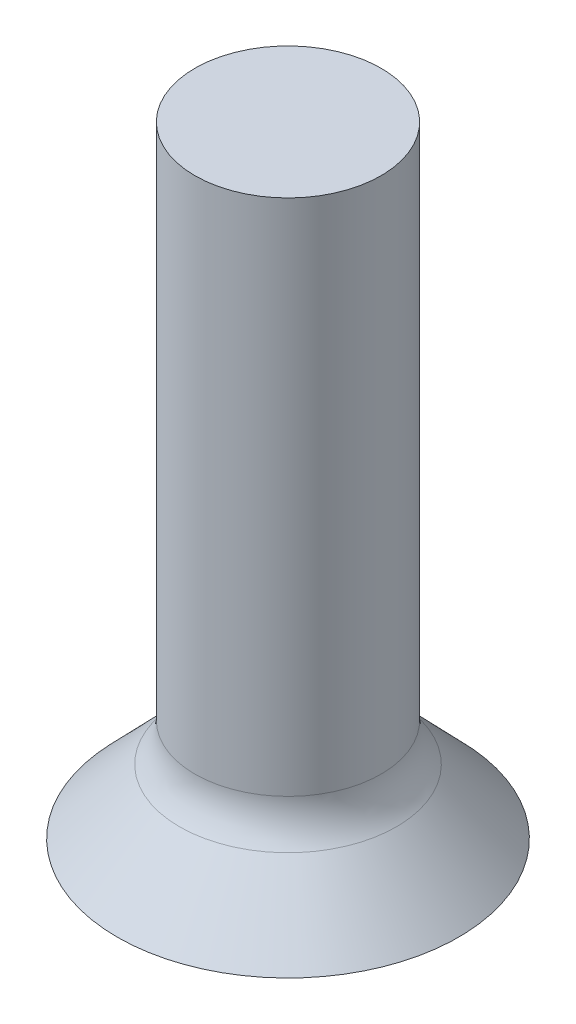
ISO-10303-21;
HEADER;
FILE_DESCRIPTION(('STEP AP214'),'2;1');
FILE_NAME('part.step','',(''),(''),'','','');
FILE_SCHEMA(('AUTOMOTIVE_DESIGN { 1 0 10303 214 1 1 1 1 }'));
ENDSEC;
DATA;
#1=APPLICATION_CONTEXT('core data for automotive mechanical design processes');
#2=APPLICATION_PROTOCOL_DEFINITION('international standard','automotive_design',2000,#1);
#3=PRODUCT_CONTEXT('',#1,'mechanical');
#4=PRODUCT('Part','Part','',(#3));
#5=PRODUCT_RELATED_PRODUCT_CATEGORY('part','',(#4));
#6=PRODUCT_DEFINITION_FORMATION('','',#4);
#7=PRODUCT_DEFINITION_CONTEXT('part definition',#1,'design');
#8=PRODUCT_DEFINITION('design','',#6,#7);
#9=PRODUCT_DEFINITION_SHAPE('','',#8);
#10=(LENGTH_UNIT() NAMED_UNIT(*) SI_UNIT(.MILLI.,.METRE.));
#11=(NAMED_UNIT(*) PLANE_ANGLE_UNIT() SI_UNIT($,.RADIAN.));
#12=(NAMED_UNIT(*) SI_UNIT($,.STERADIAN.) SOLID_ANGLE_UNIT());
#13=UNCERTAINTY_MEASURE_WITH_UNIT(LENGTH_MEASURE(1.E-05),#10,'distance_accuracy_value','');
#14=(GEOMETRIC_REPRESENTATION_CONTEXT(3) GLOBAL_UNCERTAINTY_ASSIGNED_CONTEXT((#13)) GLOBAL_UNIT_ASSIGNED_CONTEXT((#10,
#11,#12)) REPRESENTATION_CONTEXT('',''));
#15=CARTESIAN_POINT('',(0.,0.,0.));
#16=DIRECTION('',(0.,0.,1.));
#17=DIRECTION('',(1.,0.,0.));
#18=AXIS2_PLACEMENT_3D('',#15,#16,#17);
#19=CARTESIAN_POINT('',(0.,0.,0.));
#20=DIRECTION('',(0.,1.,0.));
#21=DIRECTION('',(0.,0.,1.));
#22=AXIS2_PLACEMENT_3D('',#19,#20,#21);
#23=PLANE('',#22);
#24=DIRECTION('',(1.,0.,0.));
#25=VECTOR('',#24,1.);
#26=CARTESIAN_POINT('',(0.375,0.,-0.375));
#27=LINE('',#26,#25);
#28=CARTESIAN_POINT('',(0.375,0.,-0.375));
#29=VERTEX_POINT('',#28);
#30=CARTESIAN_POINT('',(1.925,0.,-0.375));
#31=VERTEX_POINT('',#30);
#32=EDGE_CURVE('E158',#29,#31,#27,.T.);
#33=ORIENTED_EDGE('',*,*,#32,.F.);
#34=DIRECTION('',(0.,0.,1.));
#35=VECTOR('',#34,1.);
#36=CARTESIAN_POINT('',(0.375,0.,-0.375));
#37=LINE('',#36,#35);
#38=CARTESIAN_POINT('',(0.375,0.,-1.925));
#39=VERTEX_POINT('',#38);
#40=EDGE_CURVE('E48',#39,#29,#37,.T.);
#41=ORIENTED_EDGE('',*,*,#40,.F.);
#42=DIRECTION('',(1.,0.,0.));
#43=VECTOR('',#42,1.);
#44=CARTESIAN_POINT('',(-0.375,0.,-1.925));
#45=LINE('',#44,#43);
#46=CARTESIAN_POINT('',(-0.375,0.,-1.925));
#47=VERTEX_POINT('',#46);
#48=EDGE_CURVE('E185',#47,#39,#45,.T.);
#49=ORIENTED_EDGE('',*,*,#48,.F.);
#50=DIRECTION('',(0.,0.,-1.));
#51=VECTOR('',#50,1.);
#52=CARTESIAN_POINT('',(-0.375,0.,-0.375));
#53=LINE('',#52,#51);
#54=CARTESIAN_POINT('',(-0.375,0.,-0.375));
#55=VERTEX_POINT('',#54);
#56=EDGE_CURVE('E183',#55,#47,#53,.T.);
#57=ORIENTED_EDGE('',*,*,#56,.F.);
#58=DIRECTION('',(1.,0.,0.));
#59=VECTOR('',#58,1.);
#60=CARTESIAN_POINT('',(-1.925,0.,-0.375));
#61=LINE('',#60,#59);
#62=CARTESIAN_POINT('',(-1.925,0.,-0.375));
#63=VERTEX_POINT('',#62);
#64=EDGE_CURVE('E132',#63,#55,#61,.T.);
#65=ORIENTED_EDGE('',*,*,#64,.F.);
#66=DIRECTION('',(0.,0.,-1.));
#67=VECTOR('',#66,1.);
#68=CARTESIAN_POINT('',(-1.925,0.,0.375));
#69=LINE('',#68,#67);
#70=CARTESIAN_POINT('',(-1.925,0.,0.375));
#71=VERTEX_POINT('',#70);
#72=EDGE_CURVE('E179',#71,#63,#69,.T.);
#73=ORIENTED_EDGE('',*,*,#72,.F.);
#74=DIRECTION('',(-1.,0.,0.));
#75=VECTOR('',#74,1.);
#76=CARTESIAN_POINT('',(-1.925,0.,0.375));
#77=LINE('',#76,#75);
#78=CARTESIAN_POINT('',(-0.375,0.,0.375));
#79=VERTEX_POINT('',#78);
#80=EDGE_CURVE('E176',#79,#71,#77,.T.);
#81=ORIENTED_EDGE('',*,*,#80,.F.);
#82=DIRECTION('',(0.,0.,-1.));
#83=VECTOR('',#82,1.);
#84=CARTESIAN_POINT('',(-0.375,0.,1.925));
#85=LINE('',#84,#83);
#86=CARTESIAN_POINT('',(-0.375,0.,1.925));
#87=VERTEX_POINT('',#86);
#88=EDGE_CURVE('E173',#87,#79,#85,.T.);
#89=ORIENTED_EDGE('',*,*,#88,.F.);
#90=DIRECTION('',(-1.,0.,0.));
#91=VECTOR('',#90,1.);
#92=CARTESIAN_POINT('',(-0.375,0.,1.925));
#93=LINE('',#92,#91);
#94=CARTESIAN_POINT('',(0.375,0.,1.925));
#95=VERTEX_POINT('',#94);
#96=EDGE_CURVE('E170',#95,#87,#93,.T.);
#97=ORIENTED_EDGE('',*,*,#96,.F.);
#98=DIRECTION('',(0.,0.,1.));
#99=VECTOR('',#98,1.);
#100=CARTESIAN_POINT('',(0.375,0.,1.925));
#101=LINE('',#100,#99);
#102=CARTESIAN_POINT('',(0.375,0.,0.375));
#103=VERTEX_POINT('',#102);
#104=EDGE_CURVE('E167',#103,#95,#101,.T.);
#105=ORIENTED_EDGE('',*,*,#104,.F.);
#106=DIRECTION('',(-1.,0.,0.));
#107=VECTOR('',#106,1.);
#108=CARTESIAN_POINT('',(0.375,0.,0.375));
#109=LINE('',#108,#107);
#110=CARTESIAN_POINT('',(1.925,0.,0.375));
#111=VERTEX_POINT('',#110);
#112=EDGE_CURVE('E164',#111,#103,#109,.T.);
#113=ORIENTED_EDGE('',*,*,#112,.F.);
#114=DIRECTION('',(0.,0.,1.));
#115=VECTOR('',#114,1.);
#116=CARTESIAN_POINT('',(1.925,0.,0.375));
#117=LINE('',#116,#115);
#118=EDGE_CURVE('E161',#31,#111,#117,.T.);
#119=ORIENTED_EDGE('',*,*,#118,.F.);
#120=EDGE_LOOP('',(#33,#41,#49,#57,#65,#73,#81,#89,#97,#105,#113,#119));
#121=FACE_BOUND('',#120,.T.);
#122=CARTESIAN_POINT('',(0.,0.,0.));
#123=DIRECTION('',(0.,1.,0.));
#124=DIRECTION('',(0.,0.,1.));
#125=AXIS2_PLACEMENT_3D('',#122,#123,#124);
#126=CIRCLE('',#125,2.75);
#127=CARTESIAN_POINT('',(0.,0.,2.75));
#128=VERTEX_POINT('',#127);
#129=EDGE_CURVE('E11',#128,#128,#126,.T.);
#130=ORIENTED_EDGE('',*,*,#129,.F.);
#131=EDGE_LOOP('',(#130));
#132=FACE_BOUND('',#131,.T.);
#133=ADVANCED_FACE('F34',(#121,#132),#23,.F.);
#134=CARTESIAN_POINT('',(0.,0.,0.));
#135=DIRECTION('',(0.,-1.,0.));
#136=DIRECTION('',(0.,0.,-1.));
#137=AXIS2_PLACEMENT_3D('',#134,#135,#136);
#138=CONICAL_SURFACE('',#137,2.75,0.767944870877511);
#139=CARTESIAN_POINT('',(0.,1.03862493313783,0.));
#140=DIRECTION('',(0.,1.,0.));
#141=DIRECTION('',(0.,0.,1.));
#142=AXIS2_PLACEMENT_3D('',#139,#140,#141);
#143=CIRCLE('',#142,1.74701156083404);
#144=CARTESIAN_POINT('',(0.,1.03862493313783,1.74701156083404));
#145=VERTEX_POINT('',#144);
#146=EDGE_CURVE('E41',#145,#145,#143,.T.);
#147=ORIENTED_EDGE('',*,*,#146,.F.);
#148=EDGE_LOOP('',(#147));
#149=FACE_BOUND('',#148,.T.);
#150=ORIENTED_EDGE('',*,*,#129,.T.);
#151=EDGE_LOOP('',(#150));
#152=FACE_BOUND('',#151,.T.);
#153=ADVANCED_FACE('F216',(#149,#152),#138,.T.);
#154=CARTESIAN_POINT('',(0.,1.65,0.));
#155=DIRECTION('',(0.,1.,0.));
#156=DIRECTION('',(0.,0.,1.));
#157=AXIS2_PLACEMENT_3D('',#154,#155,#156);
#158=TOROIDAL_SURFACE('',#157,2.38010897566555,0.880108975665554);
#159=CARTESIAN_POINT('',(0.,1.65,0.));
#160=DIRECTION('',(0.,1.,0.));
#161=DIRECTION('',(0.,0.,1.));
#162=AXIS2_PLACEMENT_3D('',#159,#160,#161);
#163=CIRCLE('',#162,1.5);
#164=CARTESIAN_POINT('',(0.,1.65,1.5));
#165=VERTEX_POINT('',#164);
#166=EDGE_CURVE('E209',#165,#165,#163,.T.);
#167=ORIENTED_EDGE('',*,*,#166,.F.);
#168=EDGE_LOOP('',(#167));
#169=FACE_BOUND('',#168,.T.);
#170=ORIENTED_EDGE('',*,*,#146,.T.);
#171=EDGE_LOOP('',(#170));
#172=FACE_BOUND('',#171,.T.);
#173=ADVANCED_FACE('F214',(#169,#172),#158,.F.);
#174=CARTESIAN_POINT('',(0.,3.09547163022459,0.));
#175=DIRECTION('',(0.,1.,0.));
#176=DIRECTION('',(0.,0.,1.));
#177=AXIS2_PLACEMENT_3D('',#174,#175,#176);
#178=CYLINDRICAL_SURFACE('',#177,1.5);
#179=CARTESIAN_POINT('',(0.,10.,0.));
#180=DIRECTION('',(0.,1.,0.));
#181=DIRECTION('',(0.,0.,1.));
#182=AXIS2_PLACEMENT_3D('',#179,#180,#181);
#183=CIRCLE('',#182,1.5);
#184=CARTESIAN_POINT('',(0.,10.,1.5));
#185=VERTEX_POINT('',#184);
#186=EDGE_CURVE('E189',#185,#185,#183,.T.);
#187=ORIENTED_EDGE('',*,*,#186,.F.);
#188=EDGE_LOOP('',(#187));
#189=FACE_BOUND('',#188,.T.);
#190=ORIENTED_EDGE('',*,*,#166,.T.);
#191=EDGE_LOOP('',(#190));
#192=FACE_BOUND('',#191,.T.);
#193=ADVANCED_FACE('F302',(#189,#192),#178,.T.);
#194=CARTESIAN_POINT('',(1.5,10.,0.));
#195=DIRECTION('',(0.,-1.,0.));
#196=DIRECTION('',(0.,0.,-1.));
#197=AXIS2_PLACEMENT_3D('',#194,#195,#196);
#198=PLANE('',#197);
#199=ORIENTED_EDGE('',*,*,#186,.T.);
#200=EDGE_LOOP('',(#199));
#201=FACE_BOUND('',#200,.T.);
#202=ADVANCED_FACE('F268',(#201),#198,.F.);
#203=CARTESIAN_POINT('',(0.375,0.495,-0.375));
#204=DIRECTION('',(1.,0.,0.));
#205=DIRECTION('',(0.,0.,-1.));
#206=AXIS2_PLACEMENT_3D('',#203,#204,#205);
#207=PLANE('',#206);
#208=ORIENTED_EDGE('',*,*,#40,.T.);
#209=DIRECTION('',(0.,-1.,0.));
#210=VECTOR('',#209,1.);
#211=CARTESIAN_POINT('',(0.375,0.495,-0.375));
#212=LINE('',#211,#210);
#213=CARTESIAN_POINT('',(0.375,0.495,-0.375));
#214=VERTEX_POINT('',#213);
#215=EDGE_CURVE('E96',#214,#29,#212,.T.);
#216=ORIENTED_EDGE('',*,*,#215,.F.);
#217=DIRECTION('',(0.,0.,1.));
#218=VECTOR('',#217,1.);
#219=CARTESIAN_POINT('',(0.375,0.495,-0.375));
#220=LINE('',#219,#218);
#221=CARTESIAN_POINT('',(0.375,0.495,-1.925));
#222=VERTEX_POINT('',#221);
#223=EDGE_CURVE('E187',#222,#214,#220,.T.);
#224=ORIENTED_EDGE('',*,*,#223,.F.);
#225=DIRECTION('',(0.,-1.,0.));
#226=VECTOR('',#225,1.);
#227=CARTESIAN_POINT('',(0.375,0.495,-1.925));
#228=LINE('',#227,#226);
#229=EDGE_CURVE('E56',#222,#39,#228,.T.);
#230=ORIENTED_EDGE('',*,*,#229,.T.);
#231=EDGE_LOOP('',(#208,#216,#224,#230));
#232=FACE_BOUND('',#231,.T.);
#233=ADVANCED_FACE('F261',(#232),#207,.F.);
#234=CARTESIAN_POINT('',(-0.375,0.495,-1.925));
#235=DIRECTION('',(0.,0.,-1.));
#236=DIRECTION('',(-1.,0.,0.));
#237=AXIS2_PLACEMENT_3D('',#234,#235,#236);
#238=PLANE('',#237);
#239=ORIENTED_EDGE('',*,*,#48,.T.);
#240=ORIENTED_EDGE('',*,*,#229,.F.);
#241=DIRECTION('',(1.,0.,0.));
#242=VECTOR('',#241,1.);
#243=CARTESIAN_POINT('',(-0.375,0.495,-1.925));
#244=LINE('',#243,#242);
#245=CARTESIAN_POINT('',(-0.375,0.495,-1.925));
#246=VERTEX_POINT('',#245);
#247=EDGE_CURVE('E144',#246,#222,#244,.T.);
#248=ORIENTED_EDGE('',*,*,#247,.F.);
#249=DIRECTION('',(0.,-1.,0.));
#250=VECTOR('',#249,1.);
#251=CARTESIAN_POINT('',(-0.375,0.495,-1.925));
#252=LINE('',#251,#250);
#253=EDGE_CURVE('E136',#246,#47,#252,.T.);
#254=ORIENTED_EDGE('',*,*,#253,.T.);
#255=EDGE_LOOP('',(#239,#240,#248,#254));
#256=FACE_BOUND('',#255,.T.);
#257=ADVANCED_FACE('F259',(#256),#238,.F.);
#258=CARTESIAN_POINT('',(-0.375,0.495,-0.375));
#259=DIRECTION('',(-1.,0.,0.));
#260=DIRECTION('',(0.,0.,1.));
#261=AXIS2_PLACEMENT_3D('',#258,#259,#260);
#262=PLANE('',#261);
#263=ORIENTED_EDGE('',*,*,#56,.T.);
#264=ORIENTED_EDGE('',*,*,#253,.F.);
#265=DIRECTION('',(0.,0.,-1.));
#266=VECTOR('',#265,1.);
#267=CARTESIAN_POINT('',(-0.375,0.495,-0.375));
#268=LINE('',#267,#266);
#269=CARTESIAN_POINT('',(-0.375,0.495,-0.375));
#270=VERTEX_POINT('',#269);
#271=EDGE_CURVE('E140',#270,#246,#268,.T.);
#272=ORIENTED_EDGE('',*,*,#271,.F.);
#273=DIRECTION('',(0.,-1.,0.));
#274=VECTOR('',#273,1.);
#275=CARTESIAN_POINT('',(-0.375,0.495,-0.375));
#276=LINE('',#275,#274);
#277=EDGE_CURVE('E125',#270,#55,#276,.T.);
#278=ORIENTED_EDGE('',*,*,#277,.T.);
#279=EDGE_LOOP('',(#263,#264,#272,#278));
#280=FACE_BOUND('',#279,.T.);
#281=ADVANCED_FACE('F141',(#280),#262,.F.);
#282=CARTESIAN_POINT('',(-1.925,0.495,-0.375));
#283=DIRECTION('',(0.,0.,-1.));
#284=DIRECTION('',(-1.,0.,0.));
#285=AXIS2_PLACEMENT_3D('',#282,#283,#284);
#286=PLANE('',#285);
#287=ORIENTED_EDGE('',*,*,#64,.T.);
#288=ORIENTED_EDGE('',*,*,#277,.F.);
#289=DIRECTION('',(1.,0.,0.));
#290=VECTOR('',#289,1.);
#291=CARTESIAN_POINT('',(-1.925,0.495,-0.375));
#292=LINE('',#291,#290);
#293=CARTESIAN_POINT('',(-1.925,0.495,-0.375));
#294=VERTEX_POINT('',#293);
#295=EDGE_CURVE('E129',#294,#270,#292,.T.);
#296=ORIENTED_EDGE('',*,*,#295,.F.);
#297=DIRECTION('',(0.,-1.,0.));
#298=VECTOR('',#297,1.);
#299=CARTESIAN_POINT('',(-1.925,0.495,-0.375));
#300=LINE('',#299,#298);
#301=EDGE_CURVE('E137',#294,#63,#300,.T.);
#302=ORIENTED_EDGE('',*,*,#301,.T.);
#303=EDGE_LOOP('',(#287,#288,#296,#302));
#304=FACE_BOUND('',#303,.T.);
#305=ADVANCED_FACE('F127',(#304),#286,.F.);
#306=CARTESIAN_POINT('',(-1.925,0.495,0.375));
#307=DIRECTION('',(-1.,0.,0.));
#308=DIRECTION('',(0.,0.,1.));
#309=AXIS2_PLACEMENT_3D('',#306,#307,#308);
#310=PLANE('',#309);
#311=ORIENTED_EDGE('',*,*,#72,.T.);
#312=ORIENTED_EDGE('',*,*,#301,.F.);
#313=DIRECTION('',(0.,0.,-1.));
#314=VECTOR('',#313,1.);
#315=CARTESIAN_POINT('',(-1.925,0.495,0.375));
#316=LINE('',#315,#314);
#317=CARTESIAN_POINT('',(-1.925,0.495,0.375));
#318=VERTEX_POINT('',#317);
#319=EDGE_CURVE('E150',#318,#294,#316,.T.);
#320=ORIENTED_EDGE('',*,*,#319,.F.);
#321=DIRECTION('',(0.,-1.,0.));
#322=VECTOR('',#321,1.);
#323=CARTESIAN_POINT('',(-1.925,0.495,0.375));
#324=LINE('',#323,#322);
#325=EDGE_CURVE('E192',#318,#71,#324,.T.);
#326=ORIENTED_EDGE('',*,*,#325,.T.);
#327=EDGE_LOOP('',(#311,#312,#320,#326));
#328=FACE_BOUND('',#327,.T.);
#329=ADVANCED_FACE('F258',(#328),#310,.F.);
#330=CARTESIAN_POINT('',(-1.925,0.495,0.375));
#331=DIRECTION('',(0.,0.,1.));
#332=DIRECTION('',(1.,0.,0.));
#333=AXIS2_PLACEMENT_3D('',#330,#331,#332);
#334=PLANE('',#333);
#335=ORIENTED_EDGE('',*,*,#80,.T.);
#336=ORIENTED_EDGE('',*,*,#325,.F.);
#337=DIRECTION('',(-1.,0.,0.));
#338=VECTOR('',#337,1.);
#339=CARTESIAN_POINT('',(-1.925,0.495,0.375));
#340=LINE('',#339,#338);
#341=CARTESIAN_POINT('',(-0.375,0.495,0.375));
#342=VERTEX_POINT('',#341);
#343=EDGE_CURVE('E152',#342,#318,#340,.T.);
#344=ORIENTED_EDGE('',*,*,#343,.F.);
#345=DIRECTION('',(0.,-1.,0.));
#346=VECTOR('',#345,1.);
#347=CARTESIAN_POINT('',(-0.375,0.495,0.375));
#348=LINE('',#347,#346);
#349=EDGE_CURVE('E194',#342,#79,#348,.T.);
#350=ORIENTED_EDGE('',*,*,#349,.T.);
#351=EDGE_LOOP('',(#335,#336,#344,#350));
#352=FACE_BOUND('',#351,.T.);
#353=ADVANCED_FACE('F254',(#352),#334,.F.);
#354=CARTESIAN_POINT('',(-0.375,0.495,1.925));
#355=DIRECTION('',(-1.,0.,0.));
#356=DIRECTION('',(0.,0.,1.));
#357=AXIS2_PLACEMENT_3D('',#354,#355,#356);
#358=PLANE('',#357);
#359=ORIENTED_EDGE('',*,*,#88,.T.);
#360=ORIENTED_EDGE('',*,*,#349,.F.);
#361=DIRECTION('',(0.,0.,-1.));
#362=VECTOR('',#361,1.);
#363=CARTESIAN_POINT('',(-0.375,0.495,1.925));
#364=LINE('',#363,#362);
#365=CARTESIAN_POINT('',(-0.375,0.495,1.925));
#366=VERTEX_POINT('',#365);
#367=EDGE_CURVE('E249',#366,#342,#364,.T.);
#368=ORIENTED_EDGE('',*,*,#367,.F.);
#369=DIRECTION('',(0.,-1.,0.));
#370=VECTOR('',#369,1.);
#371=CARTESIAN_POINT('',(-0.375,0.495,1.925));
#372=LINE('',#371,#370);
#373=EDGE_CURVE('E196',#366,#87,#372,.T.);
#374=ORIENTED_EDGE('',*,*,#373,.T.);
#375=EDGE_LOOP('',(#359,#360,#368,#374));
#376=FACE_BOUND('',#375,.T.);
#377=ADVANCED_FACE('F278',(#376),#358,.F.);
#378=CARTESIAN_POINT('',(-0.375,0.495,1.925));
#379=DIRECTION('',(0.,0.,1.));
#380=DIRECTION('',(1.,0.,0.));
#381=AXIS2_PLACEMENT_3D('',#378,#379,#380);
#382=PLANE('',#381);
#383=ORIENTED_EDGE('',*,*,#96,.T.);
#384=ORIENTED_EDGE('',*,*,#373,.F.);
#385=DIRECTION('',(-1.,0.,0.));
#386=VECTOR('',#385,1.);
#387=CARTESIAN_POINT('',(-0.375,0.495,1.925));
#388=LINE('',#387,#386);
#389=CARTESIAN_POINT('',(0.375,0.495,1.925));
#390=VERTEX_POINT('',#389);
#391=EDGE_CURVE('E246',#390,#366,#388,.T.);
#392=ORIENTED_EDGE('',*,*,#391,.F.);
#393=DIRECTION('',(0.,-1.,0.));
#394=VECTOR('',#393,1.);
#395=CARTESIAN_POINT('',(0.375,0.495,1.925));
#396=LINE('',#395,#394);
#397=EDGE_CURVE('E198',#390,#95,#396,.T.);
#398=ORIENTED_EDGE('',*,*,#397,.T.);
#399=EDGE_LOOP('',(#383,#384,#392,#398));
#400=FACE_BOUND('',#399,.T.);
#401=ADVANCED_FACE('F281',(#400),#382,.F.);
#402=CARTESIAN_POINT('',(0.375,0.495,1.925));
#403=DIRECTION('',(1.,0.,0.));
#404=DIRECTION('',(0.,0.,-1.));
#405=AXIS2_PLACEMENT_3D('',#402,#403,#404);
#406=PLANE('',#405);
#407=ORIENTED_EDGE('',*,*,#104,.T.);
#408=ORIENTED_EDGE('',*,*,#397,.F.);
#409=DIRECTION('',(0.,0.,1.));
#410=VECTOR('',#409,1.);
#411=CARTESIAN_POINT('',(0.375,0.495,1.925));
#412=LINE('',#411,#410);
#413=CARTESIAN_POINT('',(0.375,0.495,0.375));
#414=VERTEX_POINT('',#413);
#415=EDGE_CURVE('E243',#414,#390,#412,.T.);
#416=ORIENTED_EDGE('',*,*,#415,.F.);
#417=DIRECTION('',(0.,-1.,0.));
#418=VECTOR('',#417,1.);
#419=CARTESIAN_POINT('',(0.375,0.495,0.375));
#420=LINE('',#419,#418);
#421=EDGE_CURVE('E200',#414,#103,#420,.T.);
#422=ORIENTED_EDGE('',*,*,#421,.T.);
#423=EDGE_LOOP('',(#407,#408,#416,#422));
#424=FACE_BOUND('',#423,.T.);
#425=ADVANCED_FACE('F285',(#424),#406,.F.);
#426=CARTESIAN_POINT('',(0.375,0.495,0.375));
#427=DIRECTION('',(0.,0.,1.));
#428=DIRECTION('',(1.,0.,0.));
#429=AXIS2_PLACEMENT_3D('',#426,#427,#428);
#430=PLANE('',#429);
#431=ORIENTED_EDGE('',*,*,#112,.T.);
#432=ORIENTED_EDGE('',*,*,#421,.F.);
#433=DIRECTION('',(-1.,0.,0.));
#434=VECTOR('',#433,1.);
#435=CARTESIAN_POINT('',(0.375,0.495,0.375));
#436=LINE('',#435,#434);
#437=CARTESIAN_POINT('',(1.925,0.495,0.375));
#438=VERTEX_POINT('',#437);
#439=EDGE_CURVE('E240',#438,#414,#436,.T.);
#440=ORIENTED_EDGE('',*,*,#439,.F.);
#441=DIRECTION('',(0.,-1.,0.));
#442=VECTOR('',#441,1.);
#443=CARTESIAN_POINT('',(1.925,0.495,0.375));
#444=LINE('',#443,#442);
#445=EDGE_CURVE('E202',#438,#111,#444,.T.);
#446=ORIENTED_EDGE('',*,*,#445,.T.);
#447=EDGE_LOOP('',(#431,#432,#440,#446));
#448=FACE_BOUND('',#447,.T.);
#449=ADVANCED_FACE('F289',(#448),#430,.F.);
#450=CARTESIAN_POINT('',(1.925,0.495,0.375));
#451=DIRECTION('',(1.,0.,0.));
#452=DIRECTION('',(0.,0.,-1.));
#453=AXIS2_PLACEMENT_3D('',#450,#451,#452);
#454=PLANE('',#453);
#455=ORIENTED_EDGE('',*,*,#118,.T.);
#456=ORIENTED_EDGE('',*,*,#445,.F.);
#457=DIRECTION('',(0.,0.,1.));
#458=VECTOR('',#457,1.);
#459=CARTESIAN_POINT('',(1.925,0.495,0.375));
#460=LINE('',#459,#458);
#461=CARTESIAN_POINT('',(1.925,0.495,-0.375));
#462=VERTEX_POINT('',#461);
#463=EDGE_CURVE('E235',#462,#438,#460,.T.);
#464=ORIENTED_EDGE('',*,*,#463,.F.);
#465=DIRECTION('',(0.,-1.,0.));
#466=VECTOR('',#465,1.);
#467=CARTESIAN_POINT('',(1.925,0.495,-0.375));
#468=LINE('',#467,#466);
#469=EDGE_CURVE('E204',#462,#31,#468,.T.);
#470=ORIENTED_EDGE('',*,*,#469,.T.);
#471=EDGE_LOOP('',(#455,#456,#464,#470));
#472=FACE_BOUND('',#471,.T.);
#473=ADVANCED_FACE('F293',(#472),#454,.F.);
#474=CARTESIAN_POINT('',(0.375,0.495,-0.375));
#475=DIRECTION('',(0.,0.,-1.));
#476=DIRECTION('',(-1.,0.,0.));
#477=AXIS2_PLACEMENT_3D('',#474,#475,#476);
#478=PLANE('',#477);
#479=ORIENTED_EDGE('',*,*,#32,.T.);
#480=ORIENTED_EDGE('',*,*,#469,.F.);
#481=DIRECTION('',(1.,0.,0.));
#482=VECTOR('',#481,1.);
#483=CARTESIAN_POINT('',(0.375,0.495,-0.375));
#484=LINE('',#483,#482);
#485=EDGE_CURVE('E233',#214,#462,#484,.T.);
#486=ORIENTED_EDGE('',*,*,#485,.F.);
#487=ORIENTED_EDGE('',*,*,#215,.T.);
#488=EDGE_LOOP('',(#479,#480,#486,#487));
#489=FACE_BOUND('',#488,.T.);
#490=ADVANCED_FACE('F230',(#489),#478,.F.);
#491=CARTESIAN_POINT('',(0.,0.495,0.));
#492=DIRECTION('',(0.,-1.,0.));
#493=DIRECTION('',(0.,0.,-1.));
#494=AXIS2_PLACEMENT_3D('',#491,#492,#493);
#495=PLANE('',#494);
#496=ORIENTED_EDGE('',*,*,#223,.T.);
#497=ORIENTED_EDGE('',*,*,#485,.T.);
#498=ORIENTED_EDGE('',*,*,#463,.T.);
#499=ORIENTED_EDGE('',*,*,#439,.T.);
#500=ORIENTED_EDGE('',*,*,#415,.T.);
#501=ORIENTED_EDGE('',*,*,#391,.T.);
#502=ORIENTED_EDGE('',*,*,#367,.T.);
#503=ORIENTED_EDGE('',*,*,#343,.T.);
#504=ORIENTED_EDGE('',*,*,#319,.T.);
#505=ORIENTED_EDGE('',*,*,#295,.T.);
#506=ORIENTED_EDGE('',*,*,#271,.T.);
#507=ORIENTED_EDGE('',*,*,#247,.T.);
#508=EDGE_LOOP('',(#496,#497,#498,#499,#500,#501,#502,#503,#504,#505,#506,#507));
#509=FACE_BOUND('',#508,.T.);
#510=ADVANCED_FACE('F147',(#509),#495,.T.);
#511=CLOSED_SHELL('',(#133,#153,#173,#193,#202,#233,#257,#281,#305,#329,#353,#377,#401,#425,
#449,#473,#490,#510));
#512=MANIFOLD_SOLID_BREP('B2',#511);
#513=ADVANCED_BREP_SHAPE_REPRESENTATION('',(#18,#512),#14);
#514=SHAPE_DEFINITION_REPRESENTATION(#9,#513);
ENDSEC;
END-ISO-10303-21;
